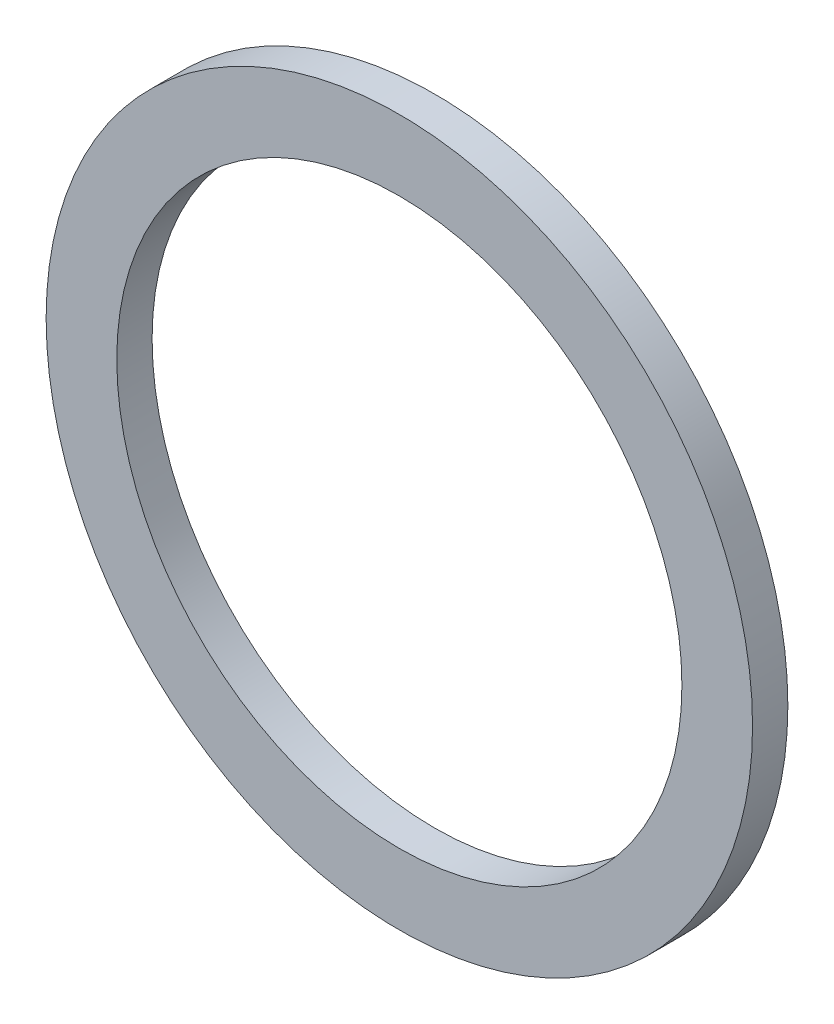
ISO-10303-21;
HEADER;
FILE_DESCRIPTION(('STEP AP214'),'2;1');
FILE_NAME('part.step','',(''),(''),'','','');
FILE_SCHEMA(('AUTOMOTIVE_DESIGN { 1 0 10303 214 1 1 1 1 }'));
ENDSEC;
DATA;
#1=APPLICATION_CONTEXT('core data for automotive mechanical design processes');
#2=APPLICATION_PROTOCOL_DEFINITION('international standard','automotive_design',2000,#1);
#3=PRODUCT_CONTEXT('',#1,'mechanical');
#4=PRODUCT('Part','Part','',(#3));
#5=PRODUCT_RELATED_PRODUCT_CATEGORY('part','',(#4));
#6=PRODUCT_DEFINITION_FORMATION('','',#4);
#7=PRODUCT_DEFINITION_CONTEXT('part definition',#1,'design');
#8=PRODUCT_DEFINITION('design','',#6,#7);
#9=PRODUCT_DEFINITION_SHAPE('','',#8);
#10=(LENGTH_UNIT() NAMED_UNIT(*) SI_UNIT(.MILLI.,.METRE.));
#11=(NAMED_UNIT(*) PLANE_ANGLE_UNIT() SI_UNIT($,.RADIAN.));
#12=(NAMED_UNIT(*) SI_UNIT($,.STERADIAN.) SOLID_ANGLE_UNIT());
#13=UNCERTAINTY_MEASURE_WITH_UNIT(LENGTH_MEASURE(1.E-05),#10,'distance_accuracy_value','');
#14=(GEOMETRIC_REPRESENTATION_CONTEXT(3) GLOBAL_UNCERTAINTY_ASSIGNED_CONTEXT((#13)) GLOBAL_UNIT_ASSIGNED_CONTEXT((#10,
#11,#12)) REPRESENTATION_CONTEXT('',''));
#15=CARTESIAN_POINT('',(0.,0.,0.));
#16=DIRECTION('',(0.,0.,1.));
#17=DIRECTION('',(1.,0.,0.));
#18=AXIS2_PLACEMENT_3D('',#15,#16,#17);
#19=CARTESIAN_POINT('',(0.,0.,1.));
#20=DIRECTION('',(0.,0.,-1.));
#21=DIRECTION('',(-1.,0.,0.));
#22=AXIS2_PLACEMENT_3D('',#19,#20,#21);
#23=CYLINDRICAL_SURFACE('',#22,10.);
#24=CARTESIAN_POINT('',(0.,0.,1.));
#25=DIRECTION('',(0.,0.,1.));
#26=DIRECTION('',(1.,0.,0.));
#27=AXIS2_PLACEMENT_3D('',#24,#25,#26);
#28=CIRCLE('',#27,10.);
#29=CARTESIAN_POINT('',(10.,0.,1.));
#30=VERTEX_POINT('',#29);
#31=EDGE_CURVE('E10',#30,#30,#28,.T.);
#32=ORIENTED_EDGE('',*,*,#31,.F.);
#33=EDGE_LOOP('',(#32));
#34=FACE_BOUND('',#33,.T.);
#35=CARTESIAN_POINT('',(0.,0.,0.));
#36=DIRECTION('',(0.,0.,1.));
#37=DIRECTION('',(1.,0.,0.));
#38=AXIS2_PLACEMENT_3D('',#35,#36,#37);
#39=CIRCLE('',#38,10.);
#40=CARTESIAN_POINT('',(10.,0.,0.));
#41=VERTEX_POINT('',#40);
#42=EDGE_CURVE('E45',#41,#41,#39,.T.);
#43=ORIENTED_EDGE('',*,*,#42,.T.);
#44=EDGE_LOOP('',(#43));
#45=FACE_BOUND('',#44,.T.);
#46=ADVANCED_FACE('F37',(#34,#45),#23,.T.);
#47=CARTESIAN_POINT('',(0.,0.,1.));
#48=DIRECTION('',(0.,0.,1.));
#49=DIRECTION('',(1.,0.,0.));
#50=AXIS2_PLACEMENT_3D('',#47,#48,#49);
#51=PLANE('',#50);
#52=CARTESIAN_POINT('',(0.,0.,1.));
#53=DIRECTION('',(0.,0.,-1.));
#54=DIRECTION('',(-1.,0.,0.));
#55=AXIS2_PLACEMENT_3D('',#52,#53,#54);
#56=CIRCLE('',#55,8.);
#57=CARTESIAN_POINT('',(-8.,0.,1.));
#58=VERTEX_POINT('',#57);
#59=EDGE_CURVE('E52',#58,#58,#56,.T.);
#60=ORIENTED_EDGE('',*,*,#59,.T.);
#61=EDGE_LOOP('',(#60));
#62=FACE_BOUND('',#61,.T.);
#63=ORIENTED_EDGE('',*,*,#31,.T.);
#64=EDGE_LOOP('',(#63));
#65=FACE_BOUND('',#64,.T.);
#66=ADVANCED_FACE('F71',(#62,#65),#51,.T.);
#67=CARTESIAN_POINT('',(0.,0.,0.));
#68=DIRECTION('',(0.,0.,1.));
#69=DIRECTION('',(1.,0.,0.));
#70=AXIS2_PLACEMENT_3D('',#67,#68,#69);
#71=PLANE('',#70);
#72=CARTESIAN_POINT('',(0.,0.,0.));
#73=DIRECTION('',(0.,0.,1.));
#74=DIRECTION('',(1.,0.,0.));
#75=AXIS2_PLACEMENT_3D('',#72,#73,#74);
#76=CIRCLE('',#75,8.);
#77=CARTESIAN_POINT('',(8.,0.,0.));
#78=VERTEX_POINT('',#77);
#79=EDGE_CURVE('E40',#78,#78,#76,.T.);
#80=ORIENTED_EDGE('',*,*,#79,.T.);
#81=EDGE_LOOP('',(#80));
#82=FACE_BOUND('',#81,.T.);
#83=ORIENTED_EDGE('',*,*,#42,.F.);
#84=EDGE_LOOP('',(#83));
#85=FACE_BOUND('',#84,.T.);
#86=ADVANCED_FACE('F61',(#82,#85),#71,.F.);
#87=CARTESIAN_POINT('',(0.,0.,1.));
#88=DIRECTION('',(0.,0.,-1.));
#89=DIRECTION('',(-1.,0.,0.));
#90=AXIS2_PLACEMENT_3D('',#87,#88,#89);
#91=CYLINDRICAL_SURFACE('',#90,8.);
#92=ORIENTED_EDGE('',*,*,#59,.F.);
#93=EDGE_LOOP('',(#92));
#94=FACE_BOUND('',#93,.T.);
#95=ORIENTED_EDGE('',*,*,#79,.F.);
#96=EDGE_LOOP('',(#95));
#97=FACE_BOUND('',#96,.T.);
#98=ADVANCED_FACE('F64',(#94,#97),#91,.F.);
#99=CLOSED_SHELL('',(#46,#66,#86,#98));
#100=MANIFOLD_SOLID_BREP('B2',#99);
#101=ADVANCED_BREP_SHAPE_REPRESENTATION('',(#18,#100),#14);
#102=SHAPE_DEFINITION_REPRESENTATION(#9,#101);
ENDSEC;
END-ISO-10303-21;
